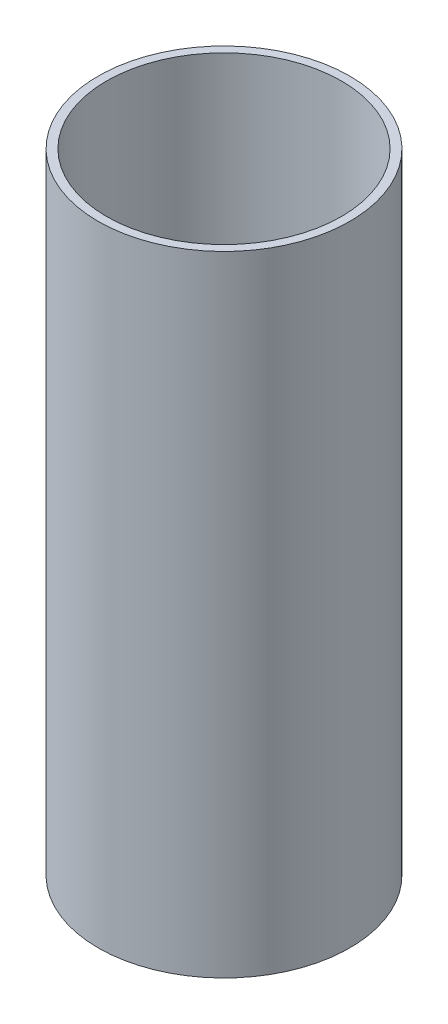
ISO-10303-21;
HEADER;
FILE_DESCRIPTION(('STEP AP214'),'2;1');
FILE_NAME('part.step','',(''),(''),'','','');
FILE_SCHEMA(('AUTOMOTIVE_DESIGN { 1 0 10303 214 1 1 1 1 }'));
ENDSEC;
DATA;
#1=APPLICATION_CONTEXT('core data for automotive mechanical design processes');
#2=APPLICATION_PROTOCOL_DEFINITION('international standard','automotive_design',2000,#1);
#3=PRODUCT_CONTEXT('',#1,'mechanical');
#4=PRODUCT('Part','Part','',(#3));
#5=PRODUCT_RELATED_PRODUCT_CATEGORY('part','',(#4));
#6=PRODUCT_DEFINITION_FORMATION('','',#4);
#7=PRODUCT_DEFINITION_CONTEXT('part definition',#1,'design');
#8=PRODUCT_DEFINITION('design','',#6,#7);
#9=PRODUCT_DEFINITION_SHAPE('','',#8);
#10=(LENGTH_UNIT() NAMED_UNIT(*) SI_UNIT(.MILLI.,.METRE.));
#11=(NAMED_UNIT(*) PLANE_ANGLE_UNIT() SI_UNIT($,.RADIAN.));
#12=(NAMED_UNIT(*) SI_UNIT($,.STERADIAN.) SOLID_ANGLE_UNIT());
#13=UNCERTAINTY_MEASURE_WITH_UNIT(LENGTH_MEASURE(1.E-05),#10,'distance_accuracy_value','');
#14=(GEOMETRIC_REPRESENTATION_CONTEXT(3) GLOBAL_UNCERTAINTY_ASSIGNED_CONTEXT((#13)) GLOBAL_UNIT_ASSIGNED_CONTEXT((#10,
#11,#12)) REPRESENTATION_CONTEXT('',''));
#15=CARTESIAN_POINT('',(0.,0.,0.));
#16=DIRECTION('',(0.,0.,1.));
#17=DIRECTION('',(1.,0.,0.));
#18=AXIS2_PLACEMENT_3D('',#15,#16,#17);
#19=CARTESIAN_POINT('',(0.,150.,0.));
#20=DIRECTION('',(0.,1.,0.));
#21=DIRECTION('',(0.,0.,1.));
#22=AXIS2_PLACEMENT_3D('',#19,#20,#21);
#23=PLANE('',#22);
#24=CARTESIAN_POINT('',(0.,150.,0.));
#25=DIRECTION('',(0.,1.,0.));
#26=DIRECTION('',(0.,0.,1.));
#27=AXIS2_PLACEMENT_3D('',#24,#25,#26);
#28=CIRCLE('',#27,30.);
#29=CARTESIAN_POINT('',(0.,150.,30.));
#30=VERTEX_POINT('',#29);
#31=EDGE_CURVE('E10',#30,#30,#28,.T.);
#32=ORIENTED_EDGE('',*,*,#31,.T.);
#33=EDGE_LOOP('',(#32));
#34=FACE_BOUND('',#33,.T.);
#35=CARTESIAN_POINT('',(0.,150.,0.));
#36=DIRECTION('',(0.,1.,0.));
#37=DIRECTION('',(0.,0.,1.));
#38=AXIS2_PLACEMENT_3D('',#35,#36,#37);
#39=CIRCLE('',#38,28.);
#40=CARTESIAN_POINT('',(0.,150.,28.));
#41=VERTEX_POINT('',#40);
#42=EDGE_CURVE('E50',#41,#41,#39,.T.);
#43=ORIENTED_EDGE('',*,*,#42,.F.);
#44=EDGE_LOOP('',(#43));
#45=FACE_BOUND('',#44,.T.);
#46=ADVANCED_FACE('F39',(#34,#45),#23,.T.);
#47=CARTESIAN_POINT('',(0.,0.,0.));
#48=DIRECTION('',(0.,1.,0.));
#49=DIRECTION('',(0.,0.,1.));
#50=AXIS2_PLACEMENT_3D('',#47,#48,#49);
#51=PLANE('',#50);
#52=CARTESIAN_POINT('',(0.,0.,0.));
#53=DIRECTION('',(0.,1.,0.));
#54=DIRECTION('',(0.,0.,1.));
#55=AXIS2_PLACEMENT_3D('',#52,#53,#54);
#56=CIRCLE('',#55,30.);
#57=CARTESIAN_POINT('',(0.,0.,30.));
#58=VERTEX_POINT('',#57);
#59=EDGE_CURVE('E43',#58,#58,#56,.T.);
#60=ORIENTED_EDGE('',*,*,#59,.F.);
#61=EDGE_LOOP('',(#60));
#62=FACE_BOUND('',#61,.T.);
#63=CARTESIAN_POINT('',(0.,0.,0.));
#64=DIRECTION('',(0.,1.,0.));
#65=DIRECTION('',(0.,0.,1.));
#66=AXIS2_PLACEMENT_3D('',#63,#64,#65);
#67=CIRCLE('',#66,28.);
#68=CARTESIAN_POINT('',(0.,0.,28.));
#69=VERTEX_POINT('',#68);
#70=EDGE_CURVE('E52',#69,#69,#67,.T.);
#71=ORIENTED_EDGE('',*,*,#70,.T.);
#72=EDGE_LOOP('',(#71));
#73=FACE_BOUND('',#72,.T.);
#74=ADVANCED_FACE('F62',(#62,#73),#51,.F.);
#75=CARTESIAN_POINT('',(0.,150.,0.));
#76=DIRECTION('',(0.,-1.,0.));
#77=DIRECTION('',(0.,0.,-1.));
#78=AXIS2_PLACEMENT_3D('',#75,#76,#77);
#79=CYLINDRICAL_SURFACE('',#78,30.);
#80=ORIENTED_EDGE('',*,*,#31,.F.);
#81=EDGE_LOOP('',(#80));
#82=FACE_BOUND('',#81,.T.);
#83=ORIENTED_EDGE('',*,*,#59,.T.);
#84=EDGE_LOOP('',(#83));
#85=FACE_BOUND('',#84,.T.);
#86=ADVANCED_FACE('F41',(#82,#85),#79,.T.);
#87=CARTESIAN_POINT('',(0.,150.,0.));
#88=DIRECTION('',(0.,-1.,0.));
#89=DIRECTION('',(0.,0.,-1.));
#90=AXIS2_PLACEMENT_3D('',#87,#88,#89);
#91=CYLINDRICAL_SURFACE('',#90,28.);
#92=ORIENTED_EDGE('',*,*,#42,.T.);
#93=EDGE_LOOP('',(#92));
#94=FACE_BOUND('',#93,.T.);
#95=ORIENTED_EDGE('',*,*,#70,.F.);
#96=EDGE_LOOP('',(#95));
#97=FACE_BOUND('',#96,.T.);
#98=ADVANCED_FACE('F58',(#94,#97),#91,.F.);
#99=CLOSED_SHELL('',(#46,#74,#86,#98));
#100=MANIFOLD_SOLID_BREP('B2',#99);
#101=ADVANCED_BREP_SHAPE_REPRESENTATION('',(#18,#100),#14);
#102=SHAPE_DEFINITION_REPRESENTATION(#9,#101);
ENDSEC;
END-ISO-10303-21;
